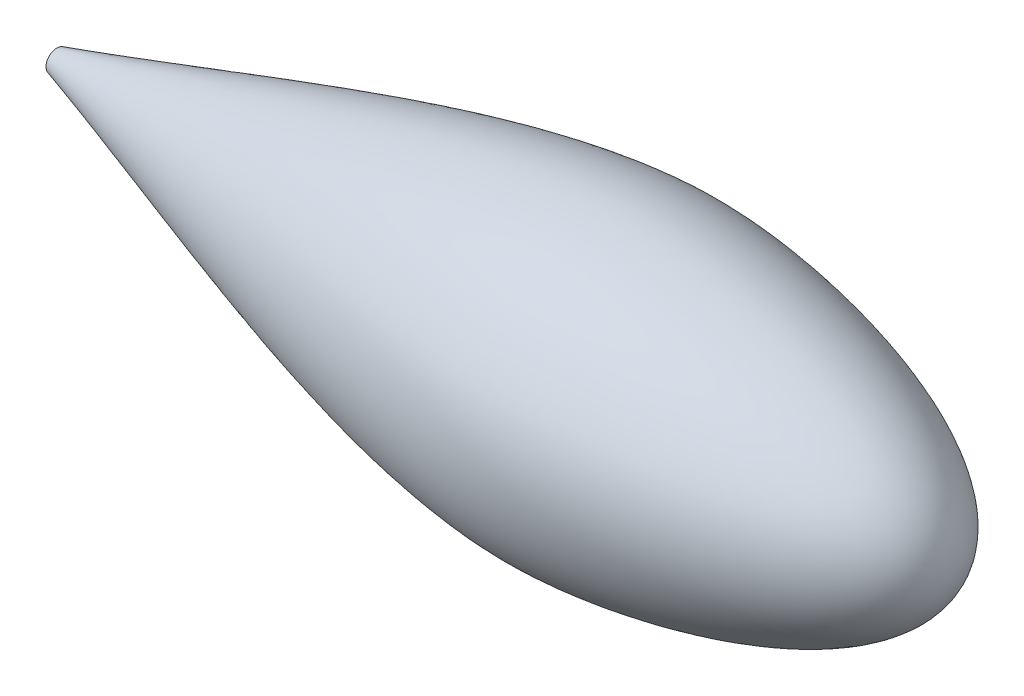
ISO-10303-21;
HEADER;
FILE_DESCRIPTION(('STEP AP214'),'2;1');
FILE_NAME('part.step','',(''),(''),'','','');
FILE_SCHEMA(('AUTOMOTIVE_DESIGN { 1 0 10303 214 1 1 1 1 }'));
ENDSEC;
DATA;
#1=APPLICATION_CONTEXT('core data for automotive mechanical design processes');
#2=APPLICATION_PROTOCOL_DEFINITION('international standard','automotive_design',2000,#1);
#3=PRODUCT_CONTEXT('',#1,'mechanical');
#4=PRODUCT('Part','Part','',(#3));
#5=PRODUCT_RELATED_PRODUCT_CATEGORY('part','',(#4));
#6=PRODUCT_DEFINITION_FORMATION('','',#4);
#7=PRODUCT_DEFINITION_CONTEXT('part definition',#1,'design');
#8=PRODUCT_DEFINITION('design','',#6,#7);
#9=PRODUCT_DEFINITION_SHAPE('','',#8);
#10=(LENGTH_UNIT() NAMED_UNIT(*) SI_UNIT(.MILLI.,.METRE.));
#11=(NAMED_UNIT(*) PLANE_ANGLE_UNIT() SI_UNIT($,.RADIAN.));
#12=(NAMED_UNIT(*) SI_UNIT($,.STERADIAN.) SOLID_ANGLE_UNIT());
#13=UNCERTAINTY_MEASURE_WITH_UNIT(LENGTH_MEASURE(1.E-05),#10,'distance_accuracy_value','');
#14=(GEOMETRIC_REPRESENTATION_CONTEXT(3) GLOBAL_UNCERTAINTY_ASSIGNED_CONTEXT((#13)) GLOBAL_UNIT_ASSIGNED_CONTEXT((#10,
#11,#12)) REPRESENTATION_CONTEXT('',''));
#15=CARTESIAN_POINT('',(0.,0.,0.));
#16=DIRECTION('',(0.,0.,1.));
#17=DIRECTION('',(1.,0.,0.));
#18=AXIS2_PLACEMENT_3D('',#15,#16,#17);
#19=CARTESIAN_POINT('',(0.,0.,0.));
#20=CARTESIAN_POINT('',(0.,0.,-24.7796633634773));
#21=CARTESIAN_POINT('',(-64.4648107819447,0.,-41.3020247535744));
#22=CARTESIAN_POINT('',(-140.894240353091,0.,-38.2932179043836));
#23=CARTESIAN_POINT('',(-203.385688688453,0.,-13.1242754775245));
#24=CARTESIAN_POINT('',(-250.,0.,0.));
#25=B_SPLINE_CURVE_WITH_KNOTS('',3,(#19,#20,#21,#22,#23,#24),.UNSPECIFIED.,.F.,.F.,(4,1,1,4),
(0.,0.33442351173941,0.43442351173941,1.),.UNSPECIFIED.);
#26=CARTESIAN_POINT('',(0.,0.,0.));
#27=DIRECTION('',(-1.,0.,0.));
#28=AXIS1_PLACEMENT('',#26,#27);
#29=SURFACE_OF_REVOLUTION('',#25,#28);
#30=CARTESIAN_POINT('',(0.,0.,0.));
#31=VERTEX_POINT('',#30);
#32=VERTEX_LOOP('',#31);
#33=FACE_BOUND('',#32,.T.);
#34=CARTESIAN_POINT('',(-240.,0.,0.));
#35=DIRECTION('',(-1.,0.,0.));
#36=DIRECTION('',(0.,0.,1.));
#37=AXIS2_PLACEMENT_3D('',#34,#35,#36);
#38=CIRCLE('',#37,2.90502774258502);
#39=CARTESIAN_POINT('',(-240.,0.,2.90502774258502));
#40=VERTEX_POINT('',#39);
#41=EDGE_CURVE('E11',#40,#40,#38,.T.);
#42=ORIENTED_EDGE('',*,*,#41,.F.);
#43=EDGE_LOOP('',(#42));
#44=FACE_BOUND('',#43,.T.);
#45=ADVANCED_FACE('F38',(#33,#44),#29,.T.);
#46=CARTESIAN_POINT('',(-240.,0.,0.));
#47=DIRECTION('',(-1.,0.,0.));
#48=DIRECTION('',(0.,0.,1.));
#49=AXIS2_PLACEMENT_3D('',#46,#47,#48);
#50=PLANE('',#49);
#51=ORIENTED_EDGE('',*,*,#41,.T.);
#52=EDGE_LOOP('',(#51));
#53=FACE_BOUND('',#52,.T.);
#54=ADVANCED_FACE('F48',(#53),#50,.T.);
#55=CLOSED_SHELL('',(#45,#54));
#56=MANIFOLD_SOLID_BREP('B2',#55);
#57=ADVANCED_BREP_SHAPE_REPRESENTATION('',(#18,#56),#14);
#58=SHAPE_DEFINITION_REPRESENTATION(#9,#57);
ENDSEC;
END-ISO-10303-21;
